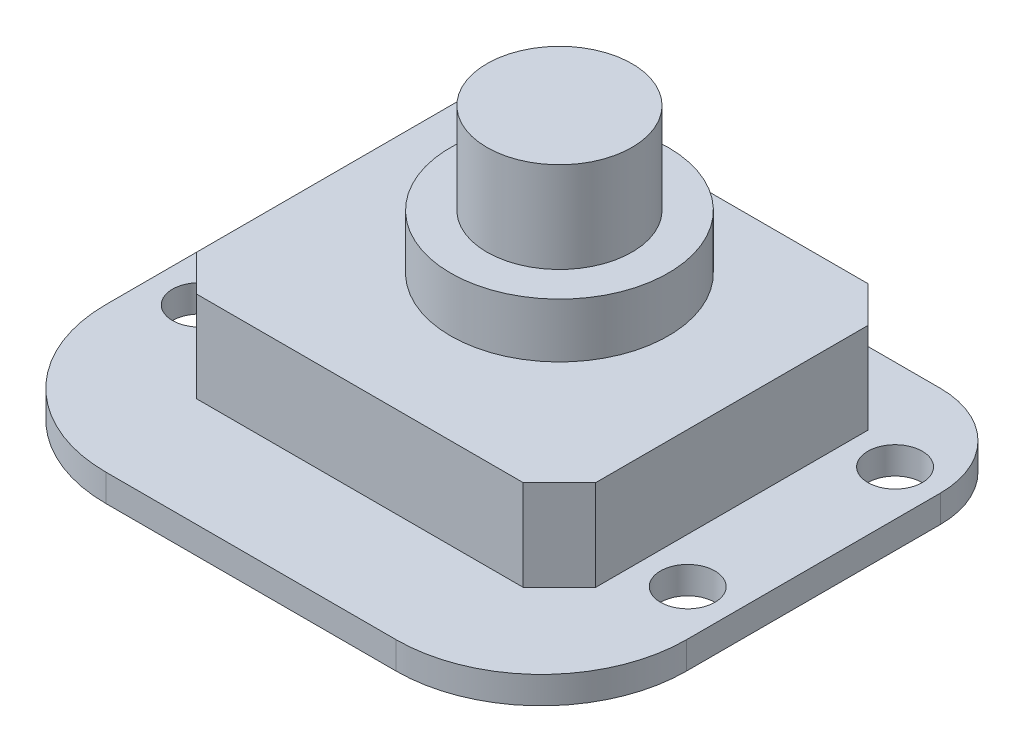
ISO-10303-21;
HEADER;
FILE_DESCRIPTION(('STEP AP214'),'2;1');
FILE_NAME('part.step','',(''),(''),'','','');
FILE_SCHEMA(('AUTOMOTIVE_DESIGN { 1 0 10303 214 1 1 1 1 }'));
ENDSEC;
DATA;
#1=APPLICATION_CONTEXT('core data for automotive mechanical design processes');
#2=APPLICATION_PROTOCOL_DEFINITION('international standard','automotive_design',2000,#1);
#3=PRODUCT_CONTEXT('',#1,'mechanical');
#4=PRODUCT('Part','Part','',(#3));
#5=PRODUCT_RELATED_PRODUCT_CATEGORY('part','',(#4));
#6=PRODUCT_DEFINITION_FORMATION('','',#4);
#7=PRODUCT_DEFINITION_CONTEXT('part definition',#1,'design');
#8=PRODUCT_DEFINITION('design','',#6,#7);
#9=PRODUCT_DEFINITION_SHAPE('','',#8);
#10=(LENGTH_UNIT() NAMED_UNIT(*) SI_UNIT(.MILLI.,.METRE.));
#11=(NAMED_UNIT(*) PLANE_ANGLE_UNIT() SI_UNIT($,.RADIAN.));
#12=(NAMED_UNIT(*) SI_UNIT($,.STERADIAN.) SOLID_ANGLE_UNIT());
#13=UNCERTAINTY_MEASURE_WITH_UNIT(LENGTH_MEASURE(1.E-05),#10,'distance_accuracy_value','');
#14=(GEOMETRIC_REPRESENTATION_CONTEXT(3) GLOBAL_UNCERTAINTY_ASSIGNED_CONTEXT((#13)) GLOBAL_UNIT_ASSIGNED_CONTEXT((#10,
#11,#12)) REPRESENTATION_CONTEXT('',''));
#15=CARTESIAN_POINT('',(0.,0.,0.));
#16=DIRECTION('',(0.,0.,1.));
#17=DIRECTION('',(1.,0.,0.));
#18=AXIS2_PLACEMENT_3D('',#15,#16,#17);
#19=CARTESIAN_POINT('',(11.,1.5,-8.5));
#20=DIRECTION('',(0.,1.,0.));
#21=DIRECTION('',(0.,0.,1.));
#22=AXIS2_PLACEMENT_3D('',#19,#20,#21);
#23=PLANE('',#22);
#24=CARTESIAN_POINT('',(-13.4,1.5,2.93));
#25=DIRECTION('',(0.,1.,0.));
#26=DIRECTION('',(0.,0.,1.));
#27=AXIS2_PLACEMENT_3D('',#24,#25,#26);
#28=CIRCLE('',#27,1.5);
#29=CARTESIAN_POINT('',(-13.4,1.5,4.43));
#30=VERTEX_POINT('',#29);
#31=EDGE_CURVE('E270',#30,#30,#28,.T.);
#32=ORIENTED_EDGE('',*,*,#31,.F.);
#33=EDGE_LOOP('',(#32));
#34=FACE_BOUND('',#33,.T.);
#35=CARTESIAN_POINT('',(-13.4,1.5,-8.5));
#36=DIRECTION('',(0.,1.,0.));
#37=DIRECTION('',(0.,0.,1.));
#38=AXIS2_PLACEMENT_3D('',#35,#36,#37);
#39=CIRCLE('',#38,1.5);
#40=CARTESIAN_POINT('',(-13.4,1.5,-7.));
#41=VERTEX_POINT('',#40);
#42=EDGE_CURVE('E161',#41,#41,#39,.T.);
#43=ORIENTED_EDGE('',*,*,#42,.F.);
#44=EDGE_LOOP('',(#43));
#45=FACE_BOUND('',#44,.T.);
#46=CARTESIAN_POINT('',(11.,1.5,-8.5));
#47=DIRECTION('',(0.,1.,0.));
#48=DIRECTION('',(0.,0.,1.));
#49=AXIS2_PLACEMENT_3D('',#46,#47,#48);
#50=CIRCLE('',#49,5.);
#51=CARTESIAN_POINT('',(16.,1.5,-8.49999999999996));
#52=VERTEX_POINT('',#51);
#53=CARTESIAN_POINT('',(11.,1.5,-13.5));
#54=VERTEX_POINT('',#53);
#55=EDGE_CURVE('E173',#52,#54,#50,.T.);
#56=ORIENTED_EDGE('',*,*,#55,.T.);
#57=DIRECTION('',(-1.,0.,0.));
#58=VECTOR('',#57,1.);
#59=CARTESIAN_POINT('',(-11.,1.5,-13.5));
#60=LINE('',#59,#58);
#61=CARTESIAN_POINT('',(-11.,1.5,-13.5));
#62=VERTEX_POINT('',#61);
#63=EDGE_CURVE('E113',#54,#62,#60,.T.);
#64=ORIENTED_EDGE('',*,*,#63,.T.);
#65=CARTESIAN_POINT('',(-11.,1.5,-8.5));
#66=DIRECTION('',(0.,1.,0.));
#67=DIRECTION('',(0.,0.,-1.));
#68=AXIS2_PLACEMENT_3D('',#65,#66,#67);
#69=CIRCLE('',#68,5.);
#70=CARTESIAN_POINT('',(-16.,1.5,-8.49999999999996));
#71=VERTEX_POINT('',#70);
#72=EDGE_CURVE('E288',#62,#71,#69,.T.);
#73=ORIENTED_EDGE('',*,*,#72,.T.);
#74=DIRECTION('',(0.,0.,1.));
#75=VECTOR('',#74,1.);
#76=CARTESIAN_POINT('',(-16.,1.5,-8.49999999999996));
#77=LINE('',#76,#75);
#78=CARTESIAN_POINT('',(-16.,1.5,5.49999999999994));
#79=VERTEX_POINT('',#78);
#80=EDGE_CURVE('E290',#71,#79,#77,.T.);
#81=ORIENTED_EDGE('',*,*,#80,.T.);
#82=CARTESIAN_POINT('',(-8.,1.5,5.5));
#83=DIRECTION('',(0.,1.,0.));
#84=DIRECTION('',(0.,0.,-1.));
#85=AXIS2_PLACEMENT_3D('',#82,#83,#84);
#86=CIRCLE('',#85,8.);
#87=CARTESIAN_POINT('',(-7.99999999999994,1.5,13.5));
#88=VERTEX_POINT('',#87);
#89=EDGE_CURVE('E136',#79,#88,#86,.T.);
#90=ORIENTED_EDGE('',*,*,#89,.T.);
#91=DIRECTION('',(1.,0.,0.));
#92=VECTOR('',#91,1.);
#93=CARTESIAN_POINT('',(-7.99999999999994,1.5,13.5));
#94=LINE('',#93,#92);
#95=CARTESIAN_POINT('',(7.99999999999995,1.5,13.5));
#96=VERTEX_POINT('',#95);
#97=EDGE_CURVE('E129',#88,#96,#94,.T.);
#98=ORIENTED_EDGE('',*,*,#97,.T.);
#99=CARTESIAN_POINT('',(8.,1.5,5.5));
#100=DIRECTION('',(0.,1.,0.));
#101=DIRECTION('',(0.,0.,1.));
#102=AXIS2_PLACEMENT_3D('',#99,#100,#101);
#103=CIRCLE('',#102,8.);
#104=CARTESIAN_POINT('',(16.,1.5,5.49999999999994));
#105=VERTEX_POINT('',#104);
#106=EDGE_CURVE('E133',#96,#105,#103,.T.);
#107=ORIENTED_EDGE('',*,*,#106,.T.);
#108=DIRECTION('',(0.,0.,-1.));
#109=VECTOR('',#108,1.);
#110=CARTESIAN_POINT('',(16.,1.5,-8.49999999999996));
#111=LINE('',#110,#109);
#112=EDGE_CURVE('E71',#105,#52,#111,.T.);
#113=ORIENTED_EDGE('',*,*,#112,.T.);
#114=EDGE_LOOP('',(#56,#64,#73,#81,#90,#98,#107,#113));
#115=FACE_BOUND('',#114,.T.);
#116=CARTESIAN_POINT('',(13.5,1.5,-8.5));
#117=DIRECTION('',(0.,1.,0.));
#118=DIRECTION('',(0.,0.,1.));
#119=AXIS2_PLACEMENT_3D('',#116,#117,#118);
#120=CIRCLE('',#119,1.5);
#121=CARTESIAN_POINT('',(13.5,1.5,-7.));
#122=VERTEX_POINT('',#121);
#123=EDGE_CURVE('E276',#122,#122,#120,.T.);
#124=ORIENTED_EDGE('',*,*,#123,.F.);
#125=EDGE_LOOP('',(#124));
#126=FACE_BOUND('',#125,.T.);
#127=CARTESIAN_POINT('',(13.5,1.5,2.93));
#128=DIRECTION('',(0.,1.,0.));
#129=DIRECTION('',(0.,0.,1.));
#130=AXIS2_PLACEMENT_3D('',#127,#128,#129);
#131=CIRCLE('',#130,1.5);
#132=CARTESIAN_POINT('',(13.5,1.5,4.43));
#133=VERTEX_POINT('',#132);
#134=EDGE_CURVE('E264',#133,#133,#131,.T.);
#135=ORIENTED_EDGE('',*,*,#134,.F.);
#136=EDGE_LOOP('',(#135));
#137=FACE_BOUND('',#136,.T.);
#138=DIRECTION('',(0.,0.,1.));
#139=VECTOR('',#138,1.);
#140=CARTESIAN_POINT('',(-11.,1.5,-9.5));
#141=LINE('',#140,#139);
#142=CARTESIAN_POINT('',(-11.,1.5,-9.5));
#143=VERTEX_POINT('',#142);
#144=CARTESIAN_POINT('',(-11.,1.5,5.5));
#145=VERTEX_POINT('',#144);
#146=EDGE_CURVE('E224',#143,#145,#141,.T.);
#147=ORIENTED_EDGE('',*,*,#146,.F.);
#148=DIRECTION('',(-0.707106781186548,0.,0.707106781186548));
#149=VECTOR('',#148,1.);
#150=CARTESIAN_POINT('',(-9.,1.5,-11.5));
#151=LINE('',#150,#149);
#152=CARTESIAN_POINT('',(-9.,1.5,-11.5));
#153=VERTEX_POINT('',#152);
#154=EDGE_CURVE('E221',#153,#143,#151,.T.);
#155=ORIENTED_EDGE('',*,*,#154,.F.);
#156=DIRECTION('',(-1.,0.,0.));
#157=VECTOR('',#156,1.);
#158=CARTESIAN_POINT('',(-9.,1.5,-11.5));
#159=LINE('',#158,#157);
#160=CARTESIAN_POINT('',(9.00000000000001,1.5,-11.5));
#161=VERTEX_POINT('',#160);
#162=EDGE_CURVE('E199',#161,#153,#159,.T.);
#163=ORIENTED_EDGE('',*,*,#162,.F.);
#164=DIRECTION('',(-0.707106781186548,0.,-0.707106781186548));
#165=VECTOR('',#164,1.);
#166=CARTESIAN_POINT('',(9.00000000000001,1.5,-11.5));
#167=LINE('',#166,#165);
#168=CARTESIAN_POINT('',(11.,1.5,-9.5));
#169=VERTEX_POINT('',#168);
#170=EDGE_CURVE('E239',#169,#161,#167,.T.);
#171=ORIENTED_EDGE('',*,*,#170,.F.);
#172=DIRECTION('',(0.,0.,-1.));
#173=VECTOR('',#172,1.);
#174=CARTESIAN_POINT('',(11.,1.5,-9.5));
#175=LINE('',#174,#173);
#176=CARTESIAN_POINT('',(11.,1.5,5.5));
#177=VERTEX_POINT('',#176);
#178=EDGE_CURVE('E236',#177,#169,#175,.T.);
#179=ORIENTED_EDGE('',*,*,#178,.F.);
#180=DIRECTION('',(0.707106781186548,0.,-0.707106781186548));
#181=VECTOR('',#180,1.);
#182=CARTESIAN_POINT('',(11.,1.5,5.5));
#183=LINE('',#182,#181);
#184=CARTESIAN_POINT('',(9.00000000000001,1.5,7.5));
#185=VERTEX_POINT('',#184);
#186=EDGE_CURVE('E233',#185,#177,#183,.T.);
#187=ORIENTED_EDGE('',*,*,#186,.F.);
#188=DIRECTION('',(1.,0.,0.));
#189=VECTOR('',#188,1.);
#190=CARTESIAN_POINT('',(-9.,1.5,7.5));
#191=LINE('',#190,#189);
#192=CARTESIAN_POINT('',(-9.,1.5,7.5));
#193=VERTEX_POINT('',#192);
#194=EDGE_CURVE('E230',#193,#185,#191,.T.);
#195=ORIENTED_EDGE('',*,*,#194,.F.);
#196=DIRECTION('',(0.707106781186548,0.,0.707106781186548));
#197=VECTOR('',#196,1.);
#198=CARTESIAN_POINT('',(-11.,1.5,5.5));
#199=LINE('',#198,#197);
#200=EDGE_CURVE('E227',#145,#193,#199,.T.);
#201=ORIENTED_EDGE('',*,*,#200,.F.);
#202=EDGE_LOOP('',(#147,#155,#163,#171,#179,#187,#195,#201));
#203=FACE_BOUND('',#202,.T.);
#204=ADVANCED_FACE('F45',(#34,#45,#115,#126,#137,#203),#23,.T.);
#205=CARTESIAN_POINT('',(11.,0.,-8.5));
#206=DIRECTION('',(0.,1.,0.));
#207=DIRECTION('',(0.,0.,1.));
#208=AXIS2_PLACEMENT_3D('',#205,#206,#207);
#209=PLANE('',#208);
#210=CARTESIAN_POINT('',(11.,0.,-8.5));
#211=DIRECTION('',(0.,1.,0.));
#212=DIRECTION('',(0.,0.,1.));
#213=AXIS2_PLACEMENT_3D('',#210,#211,#212);
#214=CIRCLE('',#213,5.);
#215=CARTESIAN_POINT('',(16.,0.,-8.49999999999996));
#216=VERTEX_POINT('',#215);
#217=CARTESIAN_POINT('',(11.,0.,-13.5));
#218=VERTEX_POINT('',#217);
#219=EDGE_CURVE('E157',#216,#218,#214,.T.);
#220=ORIENTED_EDGE('',*,*,#219,.F.);
#221=DIRECTION('',(0.,0.,-1.));
#222=VECTOR('',#221,1.);
#223=CARTESIAN_POINT('',(16.,0.,-8.49999999999996));
#224=LINE('',#223,#222);
#225=CARTESIAN_POINT('',(16.,0.,5.49999999999994));
#226=VERTEX_POINT('',#225);
#227=EDGE_CURVE('E104',#226,#216,#224,.T.);
#228=ORIENTED_EDGE('',*,*,#227,.F.);
#229=CARTESIAN_POINT('',(8.,0.,5.5));
#230=DIRECTION('',(0.,1.,0.));
#231=DIRECTION('',(0.,0.,1.));
#232=AXIS2_PLACEMENT_3D('',#229,#230,#231);
#233=CIRCLE('',#232,8.);
#234=CARTESIAN_POINT('',(7.99999999999995,0.,13.5));
#235=VERTEX_POINT('',#234);
#236=EDGE_CURVE('E170',#235,#226,#233,.T.);
#237=ORIENTED_EDGE('',*,*,#236,.F.);
#238=DIRECTION('',(1.,0.,0.));
#239=VECTOR('',#238,1.);
#240=CARTESIAN_POINT('',(-7.99999999999994,0.,13.5));
#241=LINE('',#240,#239);
#242=CARTESIAN_POINT('',(-7.99999999999994,0.,13.5));
#243=VERTEX_POINT('',#242);
#244=EDGE_CURVE('E145',#243,#235,#241,.T.);
#245=ORIENTED_EDGE('',*,*,#244,.F.);
#246=CARTESIAN_POINT('',(-8.,0.,5.5));
#247=DIRECTION('',(0.,1.,0.));
#248=DIRECTION('',(0.,0.,-1.));
#249=AXIS2_PLACEMENT_3D('',#246,#247,#248);
#250=CIRCLE('',#249,8.);
#251=CARTESIAN_POINT('',(-16.,0.,5.49999999999994));
#252=VERTEX_POINT('',#251);
#253=EDGE_CURVE('E167',#252,#243,#250,.T.);
#254=ORIENTED_EDGE('',*,*,#253,.F.);
#255=DIRECTION('',(0.,0.,1.));
#256=VECTOR('',#255,1.);
#257=CARTESIAN_POINT('',(-16.,0.,-8.49999999999996));
#258=LINE('',#257,#256);
#259=CARTESIAN_POINT('',(-16.,0.,-8.49999999999996));
#260=VERTEX_POINT('',#259);
#261=EDGE_CURVE('E165',#260,#252,#258,.T.);
#262=ORIENTED_EDGE('',*,*,#261,.F.);
#263=CARTESIAN_POINT('',(-11.,0.,-8.5));
#264=DIRECTION('',(0.,1.,0.));
#265=DIRECTION('',(0.,0.,-1.));
#266=AXIS2_PLACEMENT_3D('',#263,#264,#265);
#267=CIRCLE('',#266,5.);
#268=CARTESIAN_POINT('',(-11.,0.,-13.5));
#269=VERTEX_POINT('',#268);
#270=EDGE_CURVE('E163',#269,#260,#267,.T.);
#271=ORIENTED_EDGE('',*,*,#270,.F.);
#272=DIRECTION('',(-1.,0.,0.));
#273=VECTOR('',#272,1.);
#274=CARTESIAN_POINT('',(-11.,0.,-13.5));
#275=LINE('',#274,#273);
#276=EDGE_CURVE('E160',#218,#269,#275,.T.);
#277=ORIENTED_EDGE('',*,*,#276,.F.);
#278=EDGE_LOOP('',(#220,#228,#237,#245,#254,#262,#271,#277));
#279=FACE_BOUND('',#278,.T.);
#280=CARTESIAN_POINT('',(-13.4,0.,-8.5));
#281=DIRECTION('',(0.,1.,0.));
#282=DIRECTION('',(0.,0.,1.));
#283=AXIS2_PLACEMENT_3D('',#280,#281,#282);
#284=CIRCLE('',#283,1.5);
#285=CARTESIAN_POINT('',(-13.4,0.,-7.));
#286=VERTEX_POINT('',#285);
#287=EDGE_CURVE('E279',#286,#286,#284,.T.);
#288=ORIENTED_EDGE('',*,*,#287,.T.);
#289=EDGE_LOOP('',(#288));
#290=FACE_BOUND('',#289,.T.);
#291=CARTESIAN_POINT('',(13.5,0.,-8.5));
#292=DIRECTION('',(0.,1.,0.));
#293=DIRECTION('',(0.,0.,1.));
#294=AXIS2_PLACEMENT_3D('',#291,#292,#293);
#295=CIRCLE('',#294,1.5);
#296=CARTESIAN_POINT('',(13.5,0.,-7.));
#297=VERTEX_POINT('',#296);
#298=EDGE_CURVE('E273',#297,#297,#295,.T.);
#299=ORIENTED_EDGE('',*,*,#298,.T.);
#300=EDGE_LOOP('',(#299));
#301=FACE_BOUND('',#300,.T.);
#302=CARTESIAN_POINT('',(-13.4,0.,2.93));
#303=DIRECTION('',(0.,1.,0.));
#304=DIRECTION('',(0.,0.,1.));
#305=AXIS2_PLACEMENT_3D('',#302,#303,#304);
#306=CIRCLE('',#305,1.5);
#307=CARTESIAN_POINT('',(-13.4,0.,4.43));
#308=VERTEX_POINT('',#307);
#309=EDGE_CURVE('E267',#308,#308,#306,.T.);
#310=ORIENTED_EDGE('',*,*,#309,.T.);
#311=EDGE_LOOP('',(#310));
#312=FACE_BOUND('',#311,.T.);
#313=CARTESIAN_POINT('',(13.5,0.,2.93));
#314=DIRECTION('',(0.,1.,0.));
#315=DIRECTION('',(0.,0.,1.));
#316=AXIS2_PLACEMENT_3D('',#313,#314,#315);
#317=CIRCLE('',#316,1.5);
#318=CARTESIAN_POINT('',(13.5,0.,4.43));
#319=VERTEX_POINT('',#318);
#320=EDGE_CURVE('E263',#319,#319,#317,.T.);
#321=ORIENTED_EDGE('',*,*,#320,.T.);
#322=EDGE_LOOP('',(#321));
#323=FACE_BOUND('',#322,.T.);
#324=ADVANCED_FACE('F302',(#279,#290,#301,#312,#323),#209,.F.);
#325=CARTESIAN_POINT('',(11.,1.5,-8.5));
#326=DIRECTION('',(0.,-1.,0.));
#327=DIRECTION('',(0.,0.,-1.));
#328=AXIS2_PLACEMENT_3D('',#325,#326,#327);
#329=CYLINDRICAL_SURFACE('',#328,5.);
#330=ORIENTED_EDGE('',*,*,#219,.T.);
#331=DIRECTION('',(0.,-1.,0.));
#332=VECTOR('',#331,1.);
#333=CARTESIAN_POINT('',(11.,1.5,-13.5));
#334=LINE('',#333,#332);
#335=EDGE_CURVE('E49',#54,#218,#334,.T.);
#336=ORIENTED_EDGE('',*,*,#335,.F.);
#337=ORIENTED_EDGE('',*,*,#55,.F.);
#338=DIRECTION('',(0.,-1.,0.));
#339=VECTOR('',#338,1.);
#340=CARTESIAN_POINT('',(16.,1.5,-8.49999999999996));
#341=LINE('',#340,#339);
#342=EDGE_CURVE('E153',#52,#216,#341,.T.);
#343=ORIENTED_EDGE('',*,*,#342,.T.);
#344=EDGE_LOOP('',(#330,#336,#337,#343));
#345=FACE_BOUND('',#344,.T.);
#346=ADVANCED_FACE('F47',(#345),#329,.T.);
#347=CARTESIAN_POINT('',(-11.,1.5,-13.5));
#348=DIRECTION('',(0.,0.,1.));
#349=DIRECTION('',(1.,0.,0.));
#350=AXIS2_PLACEMENT_3D('',#347,#348,#349);
#351=PLANE('',#350);
#352=ORIENTED_EDGE('',*,*,#276,.T.);
#353=DIRECTION('',(0.,-1.,0.));
#354=VECTOR('',#353,1.);
#355=CARTESIAN_POINT('',(-11.,1.5,-13.5));
#356=LINE('',#355,#354);
#357=EDGE_CURVE('E182',#62,#269,#356,.T.);
#358=ORIENTED_EDGE('',*,*,#357,.F.);
#359=ORIENTED_EDGE('',*,*,#63,.F.);
#360=ORIENTED_EDGE('',*,*,#335,.T.);
#361=EDGE_LOOP('',(#352,#358,#359,#360));
#362=FACE_BOUND('',#361,.T.);
#363=ADVANCED_FACE('F307',(#362),#351,.F.);
#364=CARTESIAN_POINT('',(-11.,1.5,-8.5));
#365=DIRECTION('',(0.,-1.,0.));
#366=DIRECTION('',(0.,0.,-1.));
#367=AXIS2_PLACEMENT_3D('',#364,#365,#366);
#368=CYLINDRICAL_SURFACE('',#367,5.);
#369=ORIENTED_EDGE('',*,*,#270,.T.);
#370=DIRECTION('',(0.,-1.,0.));
#371=VECTOR('',#370,1.);
#372=CARTESIAN_POINT('',(-16.,1.5,-8.49999999999996));
#373=LINE('',#372,#371);
#374=EDGE_CURVE('E180',#71,#260,#373,.T.);
#375=ORIENTED_EDGE('',*,*,#374,.F.);
#376=ORIENTED_EDGE('',*,*,#72,.F.);
#377=ORIENTED_EDGE('',*,*,#357,.T.);
#378=EDGE_LOOP('',(#369,#375,#376,#377));
#379=FACE_BOUND('',#378,.T.);
#380=ADVANCED_FACE('F308',(#379),#368,.T.);
#381=CARTESIAN_POINT('',(-16.,1.5,-8.49999999999996));
#382=DIRECTION('',(1.,0.,0.));
#383=DIRECTION('',(0.,0.,-1.));
#384=AXIS2_PLACEMENT_3D('',#381,#382,#383);
#385=PLANE('',#384);
#386=ORIENTED_EDGE('',*,*,#261,.T.);
#387=DIRECTION('',(0.,-1.,0.));
#388=VECTOR('',#387,1.);
#389=CARTESIAN_POINT('',(-16.,1.5,5.49999999999994));
#390=LINE('',#389,#388);
#391=EDGE_CURVE('E177',#79,#252,#390,.T.);
#392=ORIENTED_EDGE('',*,*,#391,.F.);
#393=ORIENTED_EDGE('',*,*,#80,.F.);
#394=ORIENTED_EDGE('',*,*,#374,.T.);
#395=EDGE_LOOP('',(#386,#392,#393,#394));
#396=FACE_BOUND('',#395,.T.);
#397=ADVANCED_FACE('F295',(#396),#385,.F.);
#398=CARTESIAN_POINT('',(-8.,1.5,5.5));
#399=DIRECTION('',(0.,-1.,0.));
#400=DIRECTION('',(0.,0.,-1.));
#401=AXIS2_PLACEMENT_3D('',#398,#399,#400);
#402=CYLINDRICAL_SURFACE('',#401,8.);
#403=ORIENTED_EDGE('',*,*,#253,.T.);
#404=DIRECTION('',(0.,-1.,0.));
#405=VECTOR('',#404,1.);
#406=CARTESIAN_POINT('',(-7.99999999999994,1.5,13.5));
#407=LINE('',#406,#405);
#408=EDGE_CURVE('E148',#88,#243,#407,.T.);
#409=ORIENTED_EDGE('',*,*,#408,.F.);
#410=ORIENTED_EDGE('',*,*,#89,.F.);
#411=ORIENTED_EDGE('',*,*,#391,.T.);
#412=EDGE_LOOP('',(#403,#409,#410,#411));
#413=FACE_BOUND('',#412,.T.);
#414=ADVANCED_FACE('F299',(#413),#402,.T.);
#415=CARTESIAN_POINT('',(-7.99999999999994,1.5,13.5));
#416=DIRECTION('',(0.,0.,-1.));
#417=DIRECTION('',(-1.,0.,0.));
#418=AXIS2_PLACEMENT_3D('',#415,#416,#417);
#419=PLANE('',#418);
#420=ORIENTED_EDGE('',*,*,#244,.T.);
#421=DIRECTION('',(0.,-1.,0.));
#422=VECTOR('',#421,1.);
#423=CARTESIAN_POINT('',(7.99999999999995,1.5,13.5));
#424=LINE('',#423,#422);
#425=EDGE_CURVE('E142',#96,#235,#424,.T.);
#426=ORIENTED_EDGE('',*,*,#425,.F.);
#427=ORIENTED_EDGE('',*,*,#97,.F.);
#428=ORIENTED_EDGE('',*,*,#408,.T.);
#429=EDGE_LOOP('',(#420,#426,#427,#428));
#430=FACE_BOUND('',#429,.T.);
#431=ADVANCED_FACE('F143',(#430),#419,.F.);
#432=CARTESIAN_POINT('',(8.,1.5,5.5));
#433=DIRECTION('',(0.,-1.,0.));
#434=DIRECTION('',(0.,0.,-1.));
#435=AXIS2_PLACEMENT_3D('',#432,#433,#434);
#436=CYLINDRICAL_SURFACE('',#435,8.);
#437=ORIENTED_EDGE('',*,*,#236,.T.);
#438=DIRECTION('',(0.,-1.,0.));
#439=VECTOR('',#438,1.);
#440=CARTESIAN_POINT('',(16.,1.5,5.49999999999994));
#441=LINE('',#440,#439);
#442=EDGE_CURVE('E149',#105,#226,#441,.T.);
#443=ORIENTED_EDGE('',*,*,#442,.F.);
#444=ORIENTED_EDGE('',*,*,#106,.F.);
#445=ORIENTED_EDGE('',*,*,#425,.T.);
#446=EDGE_LOOP('',(#437,#443,#444,#445));
#447=FACE_BOUND('',#446,.T.);
#448=ADVANCED_FACE('F151',(#447),#436,.T.);
#449=CARTESIAN_POINT('',(16.,1.5,-8.49999999999996));
#450=DIRECTION('',(-1.,0.,0.));
#451=DIRECTION('',(0.,0.,1.));
#452=AXIS2_PLACEMENT_3D('',#449,#450,#451);
#453=PLANE('',#452);
#454=ORIENTED_EDGE('',*,*,#227,.T.);
#455=ORIENTED_EDGE('',*,*,#342,.F.);
#456=ORIENTED_EDGE('',*,*,#112,.F.);
#457=ORIENTED_EDGE('',*,*,#442,.T.);
#458=EDGE_LOOP('',(#454,#455,#456,#457));
#459=FACE_BOUND('',#458,.T.);
#460=ADVANCED_FACE('F304',(#459),#453,.F.);
#461=CARTESIAN_POINT('',(-13.4,1.5,-8.5));
#462=DIRECTION('',(0.,-1.,0.));
#463=DIRECTION('',(0.,0.,-1.));
#464=AXIS2_PLACEMENT_3D('',#461,#462,#463);
#465=CYLINDRICAL_SURFACE('',#464,1.5);
#466=ORIENTED_EDGE('',*,*,#42,.T.);
#467=EDGE_LOOP('',(#466));
#468=FACE_BOUND('',#467,.T.);
#469=ORIENTED_EDGE('',*,*,#287,.F.);
#470=EDGE_LOOP('',(#469));
#471=FACE_BOUND('',#470,.T.);
#472=ADVANCED_FACE('F328',(#468,#471),#465,.F.);
#473=CARTESIAN_POINT('',(13.5,1.5,-8.5));
#474=DIRECTION('',(0.,-1.,0.));
#475=DIRECTION('',(0.,0.,-1.));
#476=AXIS2_PLACEMENT_3D('',#473,#474,#475);
#477=CYLINDRICAL_SURFACE('',#476,1.5);
#478=ORIENTED_EDGE('',*,*,#123,.T.);
#479=EDGE_LOOP('',(#478));
#480=FACE_BOUND('',#479,.T.);
#481=ORIENTED_EDGE('',*,*,#298,.F.);
#482=EDGE_LOOP('',(#481));
#483=FACE_BOUND('',#482,.T.);
#484=ADVANCED_FACE('F364',(#480,#483),#477,.F.);
#485=CARTESIAN_POINT('',(-13.4,1.5,2.93));
#486=DIRECTION('',(0.,-1.,0.));
#487=DIRECTION('',(0.,0.,-1.));
#488=AXIS2_PLACEMENT_3D('',#485,#486,#487);
#489=CYLINDRICAL_SURFACE('',#488,1.5);
#490=ORIENTED_EDGE('',*,*,#31,.T.);
#491=EDGE_LOOP('',(#490));
#492=FACE_BOUND('',#491,.T.);
#493=ORIENTED_EDGE('',*,*,#309,.F.);
#494=EDGE_LOOP('',(#493));
#495=FACE_BOUND('',#494,.T.);
#496=ADVANCED_FACE('F372',(#492,#495),#489,.F.);
#497=CARTESIAN_POINT('',(13.5,1.5,2.93));
#498=DIRECTION('',(0.,-1.,0.));
#499=DIRECTION('',(0.,0.,-1.));
#500=AXIS2_PLACEMENT_3D('',#497,#498,#499);
#501=CYLINDRICAL_SURFACE('',#500,1.5);
#502=ORIENTED_EDGE('',*,*,#134,.T.);
#503=EDGE_LOOP('',(#502));
#504=FACE_BOUND('',#503,.T.);
#505=ORIENTED_EDGE('',*,*,#320,.F.);
#506=EDGE_LOOP('',(#505));
#507=FACE_BOUND('',#506,.T.);
#508=ADVANCED_FACE('F379',(#504,#507),#501,.F.);
#509=CARTESIAN_POINT('',(-9.,6.5,-11.5));
#510=DIRECTION('',(0.707106781186548,0.,0.707106781186548));
#511=DIRECTION('',(0.707106781186548,0.,-0.707106781186548));
#512=AXIS2_PLACEMENT_3D('',#509,#510,#511);
#513=PLANE('',#512);
#514=ORIENTED_EDGE('',*,*,#154,.T.);
#515=DIRECTION('',(0.,-1.,0.));
#516=VECTOR('',#515,1.);
#517=CARTESIAN_POINT('',(-11.,6.5,-9.5));
#518=LINE('',#517,#516);
#519=CARTESIAN_POINT('',(-11.,6.5,-9.5));
#520=VERTEX_POINT('',#519);
#521=EDGE_CURVE('E260',#520,#143,#518,.T.);
#522=ORIENTED_EDGE('',*,*,#521,.F.);
#523=DIRECTION('',(-0.707106781186548,0.,0.707106781186548));
#524=VECTOR('',#523,1.);
#525=CARTESIAN_POINT('',(-9.,6.5,-11.5));
#526=LINE('',#525,#524);
#527=CARTESIAN_POINT('',(-9.,6.5,-11.5));
#528=VERTEX_POINT('',#527);
#529=EDGE_CURVE('E195',#528,#520,#526,.T.);
#530=ORIENTED_EDGE('',*,*,#529,.F.);
#531=DIRECTION('',(0.,-1.,0.));
#532=VECTOR('',#531,1.);
#533=CARTESIAN_POINT('',(-9.,6.5,-11.5));
#534=LINE('',#533,#532);
#535=EDGE_CURVE('E220',#528,#153,#534,.T.);
#536=ORIENTED_EDGE('',*,*,#535,.T.);
#537=EDGE_LOOP('',(#514,#522,#530,#536));
#538=FACE_BOUND('',#537,.T.);
#539=ADVANCED_FACE('F387',(#538),#513,.F.);
#540=CARTESIAN_POINT('',(-11.,6.5,-9.5));
#541=DIRECTION('',(1.,0.,0.));
#542=DIRECTION('',(0.,0.,-1.));
#543=AXIS2_PLACEMENT_3D('',#540,#541,#542);
#544=PLANE('',#543);
#545=ORIENTED_EDGE('',*,*,#146,.T.);
#546=DIRECTION('',(0.,-1.,0.));
#547=VECTOR('',#546,1.);
#548=CARTESIAN_POINT('',(-11.,6.5,5.5));
#549=LINE('',#548,#547);
#550=CARTESIAN_POINT('',(-11.,6.5,5.5));
#551=VERTEX_POINT('',#550);
#552=EDGE_CURVE('E257',#551,#145,#549,.T.);
#553=ORIENTED_EDGE('',*,*,#552,.F.);
#554=DIRECTION('',(0.,0.,1.));
#555=VECTOR('',#554,1.);
#556=CARTESIAN_POINT('',(-11.,6.5,-9.5));
#557=LINE('',#556,#555);
#558=EDGE_CURVE('E198',#520,#551,#557,.T.);
#559=ORIENTED_EDGE('',*,*,#558,.F.);
#560=ORIENTED_EDGE('',*,*,#521,.T.);
#561=EDGE_LOOP('',(#545,#553,#559,#560));
#562=FACE_BOUND('',#561,.T.);
#563=ADVANCED_FACE('F403',(#562),#544,.F.);
#564=CARTESIAN_POINT('',(-11.,6.5,5.5));
#565=DIRECTION('',(0.707106781186548,0.,-0.707106781186548));
#566=DIRECTION('',(-0.707106781186548,0.,-0.707106781186548));
#567=AXIS2_PLACEMENT_3D('',#564,#565,#566);
#568=PLANE('',#567);
#569=ORIENTED_EDGE('',*,*,#200,.T.);
#570=DIRECTION('',(0.,-1.,0.));
#571=VECTOR('',#570,1.);
#572=CARTESIAN_POINT('',(-9.,6.5,7.5));
#573=LINE('',#572,#571);
#574=CARTESIAN_POINT('',(-9.,6.5,7.5));
#575=VERTEX_POINT('',#574);
#576=EDGE_CURVE('E254',#575,#193,#573,.T.);
#577=ORIENTED_EDGE('',*,*,#576,.F.);
#578=DIRECTION('',(0.707106781186548,0.,0.707106781186548));
#579=VECTOR('',#578,1.);
#580=CARTESIAN_POINT('',(-11.,6.5,5.5));
#581=LINE('',#580,#579);
#582=EDGE_CURVE('E202',#551,#575,#581,.T.);
#583=ORIENTED_EDGE('',*,*,#582,.F.);
#584=ORIENTED_EDGE('',*,*,#552,.T.);
#585=EDGE_LOOP('',(#569,#577,#583,#584));
#586=FACE_BOUND('',#585,.T.);
#587=ADVANCED_FACE('F413',(#586),#568,.F.);
#588=CARTESIAN_POINT('',(-9.,6.5,7.5));
#589=DIRECTION('',(0.,0.,-1.));
#590=DIRECTION('',(-1.,0.,0.));
#591=AXIS2_PLACEMENT_3D('',#588,#589,#590);
#592=PLANE('',#591);
#593=ORIENTED_EDGE('',*,*,#194,.T.);
#594=DIRECTION('',(0.,-1.,0.));
#595=VECTOR('',#594,1.);
#596=CARTESIAN_POINT('',(9.00000000000001,6.5,7.5));
#597=LINE('',#596,#595);
#598=CARTESIAN_POINT('',(9.00000000000001,6.5,7.5));
#599=VERTEX_POINT('',#598);
#600=EDGE_CURVE('E251',#599,#185,#597,.T.);
#601=ORIENTED_EDGE('',*,*,#600,.F.);
#602=DIRECTION('',(1.,0.,0.));
#603=VECTOR('',#602,1.);
#604=CARTESIAN_POINT('',(-9.,6.5,7.5));
#605=LINE('',#604,#603);
#606=EDGE_CURVE('E205',#575,#599,#605,.T.);
#607=ORIENTED_EDGE('',*,*,#606,.F.);
#608=ORIENTED_EDGE('',*,*,#576,.T.);
#609=EDGE_LOOP('',(#593,#601,#607,#608));
#610=FACE_BOUND('',#609,.T.);
#611=ADVANCED_FACE('F423',(#610),#592,.F.);
#612=CARTESIAN_POINT('',(11.,6.5,5.5));
#613=DIRECTION('',(-0.707106781186548,0.,-0.707106781186548));
#614=DIRECTION('',(-0.707106781186548,0.,0.707106781186548));
#615=AXIS2_PLACEMENT_3D('',#612,#613,#614);
#616=PLANE('',#615);
#617=ORIENTED_EDGE('',*,*,#186,.T.);
#618=DIRECTION('',(0.,-1.,0.));
#619=VECTOR('',#618,1.);
#620=CARTESIAN_POINT('',(11.,6.5,5.5));
#621=LINE('',#620,#619);
#622=CARTESIAN_POINT('',(11.,6.5,5.5));
#623=VERTEX_POINT('',#622);
#624=EDGE_CURVE('E248',#623,#177,#621,.T.);
#625=ORIENTED_EDGE('',*,*,#624,.F.);
#626=DIRECTION('',(0.707106781186548,0.,-0.707106781186548));
#627=VECTOR('',#626,1.);
#628=CARTESIAN_POINT('',(11.,6.5,5.5));
#629=LINE('',#628,#627);
#630=EDGE_CURVE('E208',#599,#623,#629,.T.);
#631=ORIENTED_EDGE('',*,*,#630,.F.);
#632=ORIENTED_EDGE('',*,*,#600,.T.);
#633=EDGE_LOOP('',(#617,#625,#631,#632));
#634=FACE_BOUND('',#633,.T.);
#635=ADVANCED_FACE('F433',(#634),#616,.F.);
#636=CARTESIAN_POINT('',(11.,6.5,-9.5));
#637=DIRECTION('',(-1.,0.,0.));
#638=DIRECTION('',(0.,0.,1.));
#639=AXIS2_PLACEMENT_3D('',#636,#637,#638);
#640=PLANE('',#639);
#641=ORIENTED_EDGE('',*,*,#178,.T.);
#642=DIRECTION('',(0.,-1.,0.));
#643=VECTOR('',#642,1.);
#644=CARTESIAN_POINT('',(11.,6.5,-9.5));
#645=LINE('',#644,#643);
#646=CARTESIAN_POINT('',(11.,6.5,-9.5));
#647=VERTEX_POINT('',#646);
#648=EDGE_CURVE('E245',#647,#169,#645,.T.);
#649=ORIENTED_EDGE('',*,*,#648,.F.);
#650=DIRECTION('',(0.,0.,-1.));
#651=VECTOR('',#650,1.);
#652=CARTESIAN_POINT('',(11.,6.5,-9.5));
#653=LINE('',#652,#651);
#654=EDGE_CURVE('E211',#623,#647,#653,.T.);
#655=ORIENTED_EDGE('',*,*,#654,.F.);
#656=ORIENTED_EDGE('',*,*,#624,.T.);
#657=EDGE_LOOP('',(#641,#649,#655,#656));
#658=FACE_BOUND('',#657,.T.);
#659=ADVANCED_FACE('F443',(#658),#640,.F.);
#660=CARTESIAN_POINT('',(9.00000000000001,6.5,-11.5));
#661=DIRECTION('',(-0.707106781186548,0.,0.707106781186548));
#662=DIRECTION('',(0.707106781186548,0.,0.707106781186548));
#663=AXIS2_PLACEMENT_3D('',#660,#661,#662);
#664=PLANE('',#663);
#665=ORIENTED_EDGE('',*,*,#170,.T.);
#666=DIRECTION('',(0.,-1.,0.));
#667=VECTOR('',#666,1.);
#668=CARTESIAN_POINT('',(9.00000000000001,6.5,-11.5));
#669=LINE('',#668,#667);
#670=CARTESIAN_POINT('',(9.00000000000001,6.5,-11.5));
#671=VERTEX_POINT('',#670);
#672=EDGE_CURVE('E62',#671,#161,#669,.T.);
#673=ORIENTED_EDGE('',*,*,#672,.F.);
#674=DIRECTION('',(-0.707106781186548,0.,-0.707106781186548));
#675=VECTOR('',#674,1.);
#676=CARTESIAN_POINT('',(9.00000000000001,6.5,-11.5));
#677=LINE('',#676,#675);
#678=EDGE_CURVE('E214',#647,#671,#677,.T.);
#679=ORIENTED_EDGE('',*,*,#678,.F.);
#680=ORIENTED_EDGE('',*,*,#648,.T.);
#681=EDGE_LOOP('',(#665,#673,#679,#680));
#682=FACE_BOUND('',#681,.T.);
#683=ADVANCED_FACE('F453',(#682),#664,.F.);
#684=CARTESIAN_POINT('',(-9.,6.5,-11.5));
#685=DIRECTION('',(0.,0.,1.));
#686=DIRECTION('',(1.,0.,0.));
#687=AXIS2_PLACEMENT_3D('',#684,#685,#686);
#688=PLANE('',#687);
#689=ORIENTED_EDGE('',*,*,#162,.T.);
#690=ORIENTED_EDGE('',*,*,#535,.F.);
#691=DIRECTION('',(-1.,0.,0.));
#692=VECTOR('',#691,1.);
#693=CARTESIAN_POINT('',(-9.,6.5,-11.5));
#694=LINE('',#693,#692);
#695=EDGE_CURVE('E217',#671,#528,#694,.T.);
#696=ORIENTED_EDGE('',*,*,#695,.F.);
#697=ORIENTED_EDGE('',*,*,#672,.T.);
#698=EDGE_LOOP('',(#689,#690,#696,#697));
#699=FACE_BOUND('',#698,.T.);
#700=ADVANCED_FACE('F463',(#699),#688,.F.);
#701=CARTESIAN_POINT('',(0.,6.5,0.));
#702=DIRECTION('',(0.,1.,0.));
#703=DIRECTION('',(0.,0.,1.));
#704=AXIS2_PLACEMENT_3D('',#701,#702,#703);
#705=PLANE('',#704);
#706=CARTESIAN_POINT('',(0.,6.5,-3.5));
#707=DIRECTION('',(0.,1.,0.));
#708=DIRECTION('',(0.,0.,1.));
#709=AXIS2_PLACEMENT_3D('',#706,#707,#708);
#710=CIRCLE('',#709,6.);
#711=CARTESIAN_POINT('',(0.,6.5,2.5));
#712=VERTEX_POINT('',#711);
#713=EDGE_CURVE('E54',#712,#712,#710,.T.);
#714=ORIENTED_EDGE('',*,*,#713,.F.);
#715=EDGE_LOOP('',(#714));
#716=FACE_BOUND('',#715,.T.);
#717=ORIENTED_EDGE('',*,*,#529,.T.);
#718=ORIENTED_EDGE('',*,*,#558,.T.);
#719=ORIENTED_EDGE('',*,*,#582,.T.);
#720=ORIENTED_EDGE('',*,*,#606,.T.);
#721=ORIENTED_EDGE('',*,*,#630,.T.);
#722=ORIENTED_EDGE('',*,*,#654,.T.);
#723=ORIENTED_EDGE('',*,*,#678,.T.);
#724=ORIENTED_EDGE('',*,*,#695,.T.);
#725=EDGE_LOOP('',(#717,#718,#719,#720,#721,#722,#723,#724));
#726=FACE_BOUND('',#725,.T.);
#727=ADVANCED_FACE('F473',(#716,#726),#705,.T.);
#728=CARTESIAN_POINT('',(0.,9.5,-3.5));
#729=DIRECTION('',(0.,-1.,0.));
#730=DIRECTION('',(0.,0.,-1.));
#731=AXIS2_PLACEMENT_3D('',#728,#729,#730);
#732=CYLINDRICAL_SURFACE('',#731,6.);
#733=CARTESIAN_POINT('',(0.,9.5,-3.5));
#734=DIRECTION('',(0.,1.,0.));
#735=DIRECTION('',(0.,0.,1.));
#736=AXIS2_PLACEMENT_3D('',#733,#734,#735);
#737=CIRCLE('',#736,6.);
#738=CARTESIAN_POINT('',(0.,9.5,2.5));
#739=VERTEX_POINT('',#738);
#740=EDGE_CURVE('E194',#739,#739,#737,.T.);
#741=ORIENTED_EDGE('',*,*,#740,.F.);
#742=EDGE_LOOP('',(#741));
#743=FACE_BOUND('',#742,.T.);
#744=ORIENTED_EDGE('',*,*,#713,.T.);
#745=EDGE_LOOP('',(#744));
#746=FACE_BOUND('',#745,.T.);
#747=ADVANCED_FACE('F482',(#743,#746),#732,.T.);
#748=CARTESIAN_POINT('',(0.,9.5,-3.5));
#749=DIRECTION('',(0.,1.,0.));
#750=DIRECTION('',(0.,0.,1.));
#751=AXIS2_PLACEMENT_3D('',#748,#749,#750);
#752=PLANE('',#751);
#753=CARTESIAN_POINT('',(0.,9.5,-3.5));
#754=DIRECTION('',(0.,1.,0.));
#755=DIRECTION('',(0.,0.,1.));
#756=AXIS2_PLACEMENT_3D('',#753,#754,#755);
#757=CIRCLE('',#756,4.);
#758=CARTESIAN_POINT('',(0.,9.5,0.5));
#759=VERTEX_POINT('',#758);
#760=EDGE_CURVE('E11',#759,#759,#757,.T.);
#761=ORIENTED_EDGE('',*,*,#760,.F.);
#762=EDGE_LOOP('',(#761));
#763=FACE_BOUND('',#762,.T.);
#764=ORIENTED_EDGE('',*,*,#740,.T.);
#765=EDGE_LOOP('',(#764));
#766=FACE_BOUND('',#765,.T.);
#767=ADVANCED_FACE('F492',(#763,#766),#752,.T.);
#768=CARTESIAN_POINT('',(0.,14.5,-3.5));
#769=DIRECTION('',(0.,-1.,0.));
#770=DIRECTION('',(0.,0.,-1.));
#771=AXIS2_PLACEMENT_3D('',#768,#769,#770);
#772=CYLINDRICAL_SURFACE('',#771,4.);
#773=CARTESIAN_POINT('',(0.,14.5,-3.5));
#774=DIRECTION('',(0.,1.,0.));
#775=DIRECTION('',(0.,0.,1.));
#776=AXIS2_PLACEMENT_3D('',#773,#774,#775);
#777=CIRCLE('',#776,4.);
#778=CARTESIAN_POINT('',(0.,14.5,0.5));
#779=VERTEX_POINT('',#778);
#780=EDGE_CURVE('E527',#779,#779,#777,.T.);
#781=ORIENTED_EDGE('',*,*,#780,.F.);
#782=EDGE_LOOP('',(#781));
#783=FACE_BOUND('',#782,.T.);
#784=ORIENTED_EDGE('',*,*,#760,.T.);
#785=EDGE_LOOP('',(#784));
#786=FACE_BOUND('',#785,.T.);
#787=ADVANCED_FACE('F502',(#783,#786),#772,.T.);
#788=CARTESIAN_POINT('',(0.,14.5,-3.5));
#789=DIRECTION('',(0.,1.,0.));
#790=DIRECTION('',(0.,0.,1.));
#791=AXIS2_PLACEMENT_3D('',#788,#789,#790);
#792=PLANE('',#791);
#793=ORIENTED_EDGE('',*,*,#780,.T.);
#794=EDGE_LOOP('',(#793));
#795=FACE_BOUND('',#794,.T.);
#796=ADVANCED_FACE('F512',(#795),#792,.T.);
#797=CLOSED_SHELL('',(#204,#324,#346,#363,#380,#397,#414,#431,#448,#460,#472,#484,#496,#508,
#539,#563,#587,#611,#635,#659,#683,#700,#727,#747,#767,#787,#796));
#798=MANIFOLD_SOLID_BREP('B2',#797);
#799=ADVANCED_BREP_SHAPE_REPRESENTATION('',(#18,#798),#14);
#800=SHAPE_DEFINITION_REPRESENTATION(#9,#799);
ENDSEC;
END-ISO-10303-21;
